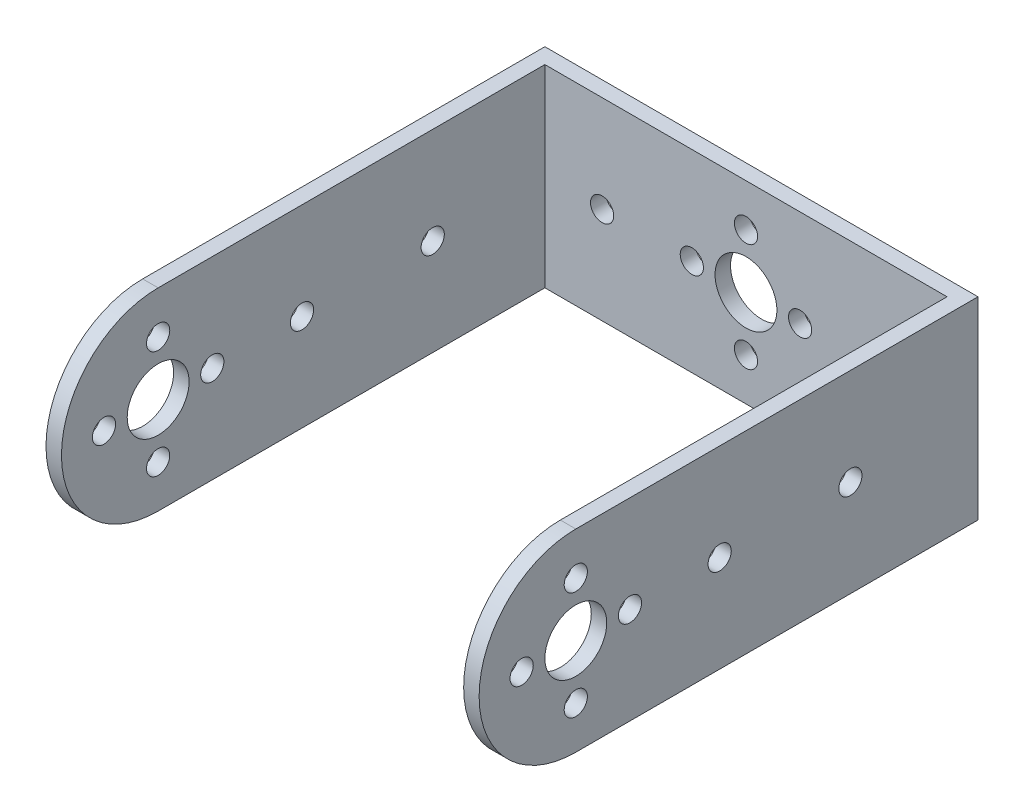
ISO-10303-21;
HEADER;
FILE_DESCRIPTION(('STEP AP214'),'2;1');
FILE_NAME('part.step','',(''),(''),'','','');
FILE_SCHEMA(('AUTOMOTIVE_DESIGN { 1 0 10303 214 1 1 1 1 }'));
ENDSEC;
DATA;
#1=APPLICATION_CONTEXT('core data for automotive mechanical design processes');
#2=APPLICATION_PROTOCOL_DEFINITION('international standard','automotive_design',2000,#1);
#3=PRODUCT_CONTEXT('',#1,'mechanical');
#4=PRODUCT('Part','Part','',(#3));
#5=PRODUCT_RELATED_PRODUCT_CATEGORY('part','',(#4));
#6=PRODUCT_DEFINITION_FORMATION('','',#4);
#7=PRODUCT_DEFINITION_CONTEXT('part definition',#1,'design');
#8=PRODUCT_DEFINITION('design','',#6,#7);
#9=PRODUCT_DEFINITION_SHAPE('','',#8);
#10=(LENGTH_UNIT() NAMED_UNIT(*) SI_UNIT(.MILLI.,.METRE.));
#11=(NAMED_UNIT(*) PLANE_ANGLE_UNIT() SI_UNIT($,.RADIAN.));
#12=(NAMED_UNIT(*) SI_UNIT($,.STERADIAN.) SOLID_ANGLE_UNIT());
#13=UNCERTAINTY_MEASURE_WITH_UNIT(LENGTH_MEASURE(1.E-05),#10,'distance_accuracy_value','');
#14=(GEOMETRIC_REPRESENTATION_CONTEXT(3) GLOBAL_UNCERTAINTY_ASSIGNED_CONTEXT((#13)) GLOBAL_UNIT_ASSIGNED_CONTEXT((#10,
#11,#12)) REPRESENTATION_CONTEXT('',''));
#15=CARTESIAN_POINT('',(0.,0.,0.));
#16=DIRECTION('',(0.,0.,1.));
#17=DIRECTION('',(1.,0.,0.));
#18=AXIS2_PLACEMENT_3D('',#15,#16,#17);
#19=CARTESIAN_POINT('',(28.,12.5,64.5));
#20=DIRECTION('',(-1.,0.,0.));
#21=DIRECTION('',(0.,0.,1.));
#22=AXIS2_PLACEMENT_3D('',#19,#20,#21);
#23=PLANE('',#22);
#24=CARTESIAN_POINT('',(28.,0.,45.));
#25=DIRECTION('',(1.,0.,0.));
#26=DIRECTION('',(0.,0.,-1.));
#27=AXIS2_PLACEMENT_3D('',#24,#25,#26);
#28=CIRCLE('',#27,1.5);
#29=CARTESIAN_POINT('',(28.,0.,43.5));
#30=VERTEX_POINT('',#29);
#31=EDGE_CURVE('E311',#30,#30,#28,.T.);
#32=ORIENTED_EDGE('',*,*,#31,.F.);
#33=EDGE_LOOP('',(#32));
#34=FACE_BOUND('',#33,.T.);
#35=CARTESIAN_POINT('',(28.,-7.00000000000001,52.));
#36=DIRECTION('',(1.,0.,0.));
#37=DIRECTION('',(0.,0.,-1.));
#38=AXIS2_PLACEMENT_3D('',#35,#36,#37);
#39=CIRCLE('',#38,1.5);
#40=CARTESIAN_POINT('',(28.,-7.00000000000001,50.5));
#41=VERTEX_POINT('',#40);
#42=EDGE_CURVE('E315',#41,#41,#39,.T.);
#43=ORIENTED_EDGE('',*,*,#42,.F.);
#44=EDGE_LOOP('',(#43));
#45=FACE_BOUND('',#44,.T.);
#46=CARTESIAN_POINT('',(28.,0.,59.));
#47=DIRECTION('',(1.,0.,0.));
#48=DIRECTION('',(0.,0.,-1.));
#49=AXIS2_PLACEMENT_3D('',#46,#47,#48);
#50=CIRCLE('',#49,1.50000000000002);
#51=CARTESIAN_POINT('',(28.,0.,57.5));
#52=VERTEX_POINT('',#51);
#53=EDGE_CURVE('E319',#52,#52,#50,.T.);
#54=ORIENTED_EDGE('',*,*,#53,.F.);
#55=EDGE_LOOP('',(#54));
#56=FACE_BOUND('',#55,.T.);
#57=CARTESIAN_POINT('',(28.,6.99999999999999,52.));
#58=DIRECTION('',(1.,0.,0.));
#59=DIRECTION('',(0.,0.,-1.));
#60=AXIS2_PLACEMENT_3D('',#57,#58,#59);
#61=CIRCLE('',#60,1.5);
#62=CARTESIAN_POINT('',(28.,6.99999999999999,50.5));
#63=VERTEX_POINT('',#62);
#64=EDGE_CURVE('E323',#63,#63,#61,.T.);
#65=ORIENTED_EDGE('',*,*,#64,.F.);
#66=EDGE_LOOP('',(#65));
#67=FACE_BOUND('',#66,.T.);
#68=CARTESIAN_POINT('',(28.,0.,52.));
#69=DIRECTION('',(1.,0.,0.));
#70=DIRECTION('',(0.,0.,-1.));
#71=AXIS2_PLACEMENT_3D('',#68,#69,#70);
#72=CIRCLE('',#71,4.);
#73=CARTESIAN_POINT('',(28.,0.,48.));
#74=VERTEX_POINT('',#73);
#75=EDGE_CURVE('E327',#74,#74,#72,.T.);
#76=ORIENTED_EDGE('',*,*,#75,.F.);
#77=EDGE_LOOP('',(#76));
#78=FACE_BOUND('',#77,.T.);
#79=CARTESIAN_POINT('',(28.,0.,16.5));
#80=DIRECTION('',(1.,0.,0.));
#81=DIRECTION('',(0.,0.,-1.));
#82=AXIS2_PLACEMENT_3D('',#79,#80,#81);
#83=CIRCLE('',#82,1.5);
#84=CARTESIAN_POINT('',(28.,0.,15.));
#85=VERTEX_POINT('',#84);
#86=EDGE_CURVE('E331',#85,#85,#83,.T.);
#87=ORIENTED_EDGE('',*,*,#86,.F.);
#88=EDGE_LOOP('',(#87));
#89=FACE_BOUND('',#88,.T.);
#90=CARTESIAN_POINT('',(28.,0.,33.4));
#91=DIRECTION('',(1.,0.,0.));
#92=DIRECTION('',(0.,0.,-1.));
#93=AXIS2_PLACEMENT_3D('',#90,#91,#92);
#94=CIRCLE('',#93,1.5);
#95=CARTESIAN_POINT('',(28.,0.,31.9));
#96=VERTEX_POINT('',#95);
#97=EDGE_CURVE('E183',#96,#96,#94,.T.);
#98=ORIENTED_EDGE('',*,*,#97,.F.);
#99=EDGE_LOOP('',(#98));
#100=FACE_BOUND('',#99,.T.);
#101=CARTESIAN_POINT('',(28.,0.,52.));
#102=DIRECTION('',(1.,0.,0.));
#103=DIRECTION('',(0.,0.,-1.));
#104=AXIS2_PLACEMENT_3D('',#101,#102,#103);
#105=CIRCLE('',#104,12.5);
#106=CARTESIAN_POINT('',(28.,12.5,52.));
#107=VERTEX_POINT('',#106);
#108=CARTESIAN_POINT('',(28.,-12.5,52.));
#109=VERTEX_POINT('',#108);
#110=EDGE_CURVE('E117',#107,#109,#105,.T.);
#111=ORIENTED_EDGE('',*,*,#110,.T.);
#112=DIRECTION('',(0.,0.,-1.));
#113=VECTOR('',#112,1.);
#114=CARTESIAN_POINT('',(28.,-12.5,64.5));
#115=LINE('',#114,#113);
#116=CARTESIAN_POINT('',(28.,-12.5,0.));
#117=VERTEX_POINT('',#116);
#118=EDGE_CURVE('E77',#109,#117,#115,.T.);
#119=ORIENTED_EDGE('',*,*,#118,.T.);
#120=DIRECTION('',(0.,1.,0.));
#121=VECTOR('',#120,1.);
#122=CARTESIAN_POINT('',(28.,12.5,0.));
#123=LINE('',#122,#121);
#124=CARTESIAN_POINT('',(28.,12.5,0.));
#125=VERTEX_POINT('',#124);
#126=EDGE_CURVE('E256',#117,#125,#123,.T.);
#127=ORIENTED_EDGE('',*,*,#126,.T.);
#128=DIRECTION('',(0.,0.,-1.));
#129=VECTOR('',#128,1.);
#130=CARTESIAN_POINT('',(28.,12.5,64.5));
#131=LINE('',#130,#129);
#132=EDGE_CURVE('E61',#107,#125,#131,.T.);
#133=ORIENTED_EDGE('',*,*,#132,.F.);
#134=EDGE_LOOP('',(#111,#119,#127,#133));
#135=FACE_BOUND('',#134,.T.);
#136=ADVANCED_FACE('F53',(#34,#45,#56,#67,#78,#89,#100,#135),#23,.F.);
#137=CARTESIAN_POINT('',(-28.,12.5,64.5));
#138=DIRECTION('',(1.,0.,0.));
#139=DIRECTION('',(0.,0.,-1.));
#140=AXIS2_PLACEMENT_3D('',#137,#138,#139);
#141=PLANE('',#140);
#142=CARTESIAN_POINT('',(-28.,0.,45.));
#143=DIRECTION('',(1.,0.,0.));
#144=DIRECTION('',(0.,0.,-1.));
#145=AXIS2_PLACEMENT_3D('',#142,#143,#144);
#146=CIRCLE('',#145,1.5);
#147=CARTESIAN_POINT('',(-28.,0.,43.5));
#148=VERTEX_POINT('',#147);
#149=EDGE_CURVE('E591',#148,#148,#146,.T.);
#150=ORIENTED_EDGE('',*,*,#149,.T.);
#151=EDGE_LOOP('',(#150));
#152=FACE_BOUND('',#151,.T.);
#153=CARTESIAN_POINT('',(-28.,-7.00000000000001,52.));
#154=DIRECTION('',(1.,0.,0.));
#155=DIRECTION('',(0.,0.,-1.));
#156=AXIS2_PLACEMENT_3D('',#153,#154,#155);
#157=CIRCLE('',#156,1.5);
#158=CARTESIAN_POINT('',(-28.,-7.00000000000001,50.5));
#159=VERTEX_POINT('',#158);
#160=EDGE_CURVE('E621',#159,#159,#157,.T.);
#161=ORIENTED_EDGE('',*,*,#160,.T.);
#162=EDGE_LOOP('',(#161));
#163=FACE_BOUND('',#162,.T.);
#164=CARTESIAN_POINT('',(-28.,0.,59.));
#165=DIRECTION('',(1.,0.,0.));
#166=DIRECTION('',(0.,0.,-1.));
#167=AXIS2_PLACEMENT_3D('',#164,#165,#166);
#168=CIRCLE('',#167,1.50000000000002);
#169=CARTESIAN_POINT('',(-28.,0.,57.5));
#170=VERTEX_POINT('',#169);
#171=EDGE_CURVE('E608',#170,#170,#168,.T.);
#172=ORIENTED_EDGE('',*,*,#171,.T.);
#173=EDGE_LOOP('',(#172));
#174=FACE_BOUND('',#173,.T.);
#175=CARTESIAN_POINT('',(-28.,6.99999999999999,52.));
#176=DIRECTION('',(1.,0.,0.));
#177=DIRECTION('',(0.,0.,-1.));
#178=AXIS2_PLACEMENT_3D('',#175,#176,#177);
#179=CIRCLE('',#178,1.5);
#180=CARTESIAN_POINT('',(-28.,6.99999999999999,50.5));
#181=VERTEX_POINT('',#180);
#182=EDGE_CURVE('E604',#181,#181,#179,.T.);
#183=ORIENTED_EDGE('',*,*,#182,.T.);
#184=EDGE_LOOP('',(#183));
#185=FACE_BOUND('',#184,.T.);
#186=CARTESIAN_POINT('',(-28.,0.,52.));
#187=DIRECTION('',(1.,0.,0.));
#188=DIRECTION('',(0.,0.,-1.));
#189=AXIS2_PLACEMENT_3D('',#186,#187,#188);
#190=CIRCLE('',#189,4.);
#191=CARTESIAN_POINT('',(-28.,0.,48.));
#192=VERTEX_POINT('',#191);
#193=EDGE_CURVE('E600',#192,#192,#190,.T.);
#194=ORIENTED_EDGE('',*,*,#193,.T.);
#195=EDGE_LOOP('',(#194));
#196=FACE_BOUND('',#195,.T.);
#197=CARTESIAN_POINT('',(-28.,0.,16.5));
#198=DIRECTION('',(1.,0.,0.));
#199=DIRECTION('',(0.,0.,-1.));
#200=AXIS2_PLACEMENT_3D('',#197,#198,#199);
#201=CIRCLE('',#200,1.5);
#202=CARTESIAN_POINT('',(-28.,0.,15.));
#203=VERTEX_POINT('',#202);
#204=EDGE_CURVE('E154',#203,#203,#201,.T.);
#205=ORIENTED_EDGE('',*,*,#204,.T.);
#206=EDGE_LOOP('',(#205));
#207=FACE_BOUND('',#206,.T.);
#208=CARTESIAN_POINT('',(-28.,0.,33.4));
#209=DIRECTION('',(1.,0.,0.));
#210=DIRECTION('',(0.,0.,-1.));
#211=AXIS2_PLACEMENT_3D('',#208,#209,#210);
#212=CIRCLE('',#211,1.5);
#213=CARTESIAN_POINT('',(-28.,0.,31.9));
#214=VERTEX_POINT('',#213);
#215=EDGE_CURVE('E149',#214,#214,#212,.T.);
#216=ORIENTED_EDGE('',*,*,#215,.T.);
#217=EDGE_LOOP('',(#216));
#218=FACE_BOUND('',#217,.T.);
#219=DIRECTION('',(0.,0.,-1.));
#220=VECTOR('',#219,1.);
#221=CARTESIAN_POINT('',(-28.,-12.5,64.5));
#222=LINE('',#221,#220);
#223=CARTESIAN_POINT('',(-28.,-12.5,52.));
#224=VERTEX_POINT('',#223);
#225=CARTESIAN_POINT('',(-28.,-12.5,0.));
#226=VERTEX_POINT('',#225);
#227=EDGE_CURVE('E136',#224,#226,#222,.T.);
#228=ORIENTED_EDGE('',*,*,#227,.F.);
#229=CARTESIAN_POINT('',(-28.,0.,52.));
#230=DIRECTION('',(1.,0.,0.));
#231=DIRECTION('',(0.,0.,-1.));
#232=AXIS2_PLACEMENT_3D('',#229,#230,#231);
#233=CIRCLE('',#232,12.5);
#234=CARTESIAN_POINT('',(-28.,12.5,52.));
#235=VERTEX_POINT('',#234);
#236=EDGE_CURVE('E119',#235,#224,#233,.T.);
#237=ORIENTED_EDGE('',*,*,#236,.F.);
#238=DIRECTION('',(0.,0.,-1.));
#239=VECTOR('',#238,1.);
#240=CARTESIAN_POINT('',(-28.,12.5,64.5));
#241=LINE('',#240,#239);
#242=CARTESIAN_POINT('',(-28.,12.5,0.));
#243=VERTEX_POINT('',#242);
#244=EDGE_CURVE('E138',#235,#243,#241,.T.);
#245=ORIENTED_EDGE('',*,*,#244,.T.);
#246=DIRECTION('',(0.,-1.,0.));
#247=VECTOR('',#246,1.);
#248=CARTESIAN_POINT('',(-28.,12.5,0.));
#249=LINE('',#248,#247);
#250=EDGE_CURVE('E140',#243,#226,#249,.T.);
#251=ORIENTED_EDGE('',*,*,#250,.T.);
#252=EDGE_LOOP('',(#228,#237,#245,#251));
#253=FACE_BOUND('',#252,.T.);
#254=ADVANCED_FACE('F266',(#152,#163,#174,#185,#196,#207,#218,#253),#141,.F.);
#255=CARTESIAN_POINT('',(26.,12.5,64.5));
#256=DIRECTION('',(1.,0.,0.));
#257=DIRECTION('',(0.,0.,-1.));
#258=AXIS2_PLACEMENT_3D('',#255,#256,#257);
#259=PLANE('',#258);
#260=CARTESIAN_POINT('',(26.,0.,45.));
#261=DIRECTION('',(1.,0.,0.));
#262=DIRECTION('',(0.,0.,-1.));
#263=AXIS2_PLACEMENT_3D('',#260,#261,#262);
#264=CIRCLE('',#263,1.5);
#265=CARTESIAN_POINT('',(26.,0.,43.5));
#266=VERTEX_POINT('',#265);
#267=EDGE_CURVE('E180',#266,#266,#264,.T.);
#268=ORIENTED_EDGE('',*,*,#267,.T.);
#269=EDGE_LOOP('',(#268));
#270=FACE_BOUND('',#269,.T.);
#271=CARTESIAN_POINT('',(26.,-7.00000000000001,52.));
#272=DIRECTION('',(1.,0.,0.));
#273=DIRECTION('',(0.,0.,-1.));
#274=AXIS2_PLACEMENT_3D('',#271,#272,#273);
#275=CIRCLE('',#274,1.5);
#276=CARTESIAN_POINT('',(26.,-7.00000000000001,50.5));
#277=VERTEX_POINT('',#276);
#278=EDGE_CURVE('E168',#277,#277,#275,.T.);
#279=ORIENTED_EDGE('',*,*,#278,.T.);
#280=EDGE_LOOP('',(#279));
#281=FACE_BOUND('',#280,.T.);
#282=CARTESIAN_POINT('',(26.,0.,59.));
#283=DIRECTION('',(1.,0.,0.));
#284=DIRECTION('',(0.,0.,-1.));
#285=AXIS2_PLACEMENT_3D('',#282,#283,#284);
#286=CIRCLE('',#285,1.50000000000002);
#287=CARTESIAN_POINT('',(26.,0.,57.5));
#288=VERTEX_POINT('',#287);
#289=EDGE_CURVE('E165',#288,#288,#286,.T.);
#290=ORIENTED_EDGE('',*,*,#289,.T.);
#291=EDGE_LOOP('',(#290));
#292=FACE_BOUND('',#291,.T.);
#293=CARTESIAN_POINT('',(26.,6.99999999999999,52.));
#294=DIRECTION('',(1.,0.,0.));
#295=DIRECTION('',(0.,0.,-1.));
#296=AXIS2_PLACEMENT_3D('',#293,#294,#295);
#297=CIRCLE('',#296,1.5);
#298=CARTESIAN_POINT('',(26.,6.99999999999999,50.5));
#299=VERTEX_POINT('',#298);
#300=EDGE_CURVE('E162',#299,#299,#297,.T.);
#301=ORIENTED_EDGE('',*,*,#300,.T.);
#302=EDGE_LOOP('',(#301));
#303=FACE_BOUND('',#302,.T.);
#304=CARTESIAN_POINT('',(26.,0.,52.));
#305=DIRECTION('',(1.,0.,0.));
#306=DIRECTION('',(0.,0.,-1.));
#307=AXIS2_PLACEMENT_3D('',#304,#305,#306);
#308=CIRCLE('',#307,4.);
#309=CARTESIAN_POINT('',(26.,0.,48.));
#310=VERTEX_POINT('',#309);
#311=EDGE_CURVE('E158',#310,#310,#308,.T.);
#312=ORIENTED_EDGE('',*,*,#311,.T.);
#313=EDGE_LOOP('',(#312));
#314=FACE_BOUND('',#313,.T.);
#315=CARTESIAN_POINT('',(26.,0.,16.5));
#316=DIRECTION('',(1.,0.,0.));
#317=DIRECTION('',(0.,0.,-1.));
#318=AXIS2_PLACEMENT_3D('',#315,#316,#317);
#319=CIRCLE('',#318,1.5);
#320=CARTESIAN_POINT('',(26.,0.,15.));
#321=VERTEX_POINT('',#320);
#322=EDGE_CURVE('E153',#321,#321,#319,.T.);
#323=ORIENTED_EDGE('',*,*,#322,.T.);
#324=EDGE_LOOP('',(#323));
#325=FACE_BOUND('',#324,.T.);
#326=CARTESIAN_POINT('',(26.,0.,33.4));
#327=DIRECTION('',(1.,0.,0.));
#328=DIRECTION('',(0.,0.,-1.));
#329=AXIS2_PLACEMENT_3D('',#326,#327,#328);
#330=CIRCLE('',#329,1.5);
#331=CARTESIAN_POINT('',(26.,0.,31.9));
#332=VERTEX_POINT('',#331);
#333=EDGE_CURVE('E129',#332,#332,#330,.T.);
#334=ORIENTED_EDGE('',*,*,#333,.T.);
#335=EDGE_LOOP('',(#334));
#336=FACE_BOUND('',#335,.T.);
#337=DIRECTION('',(0.,0.,1.));
#338=VECTOR('',#337,1.);
#339=CARTESIAN_POINT('',(26.,-12.5,64.5));
#340=LINE('',#339,#338);
#341=CARTESIAN_POINT('',(26.,-12.5,1.99999999999999));
#342=VERTEX_POINT('',#341);
#343=CARTESIAN_POINT('',(26.,-12.5,52.));
#344=VERTEX_POINT('',#343);
#345=EDGE_CURVE('E242',#342,#344,#340,.T.);
#346=ORIENTED_EDGE('',*,*,#345,.T.);
#347=CARTESIAN_POINT('',(26.,0.,52.));
#348=DIRECTION('',(1.,0.,0.));
#349=DIRECTION('',(0.,0.,-1.));
#350=AXIS2_PLACEMENT_3D('',#347,#348,#349);
#351=CIRCLE('',#350,12.5);
#352=CARTESIAN_POINT('',(26.,12.5,52.));
#353=VERTEX_POINT('',#352);
#354=EDGE_CURVE('E125',#353,#344,#351,.T.);
#355=ORIENTED_EDGE('',*,*,#354,.F.);
#356=DIRECTION('',(0.,0.,1.));
#357=VECTOR('',#356,1.);
#358=CARTESIAN_POINT('',(26.,12.5,64.5));
#359=LINE('',#358,#357);
#360=CARTESIAN_POINT('',(26.,12.5,1.99999999999999));
#361=VERTEX_POINT('',#360);
#362=EDGE_CURVE('E245',#361,#353,#359,.T.);
#363=ORIENTED_EDGE('',*,*,#362,.F.);
#364=DIRECTION('',(0.,-1.,0.));
#365=VECTOR('',#364,1.);
#366=CARTESIAN_POINT('',(26.,12.5,1.99999999999999));
#367=LINE('',#366,#365);
#368=EDGE_CURVE('E254',#361,#342,#367,.T.);
#369=ORIENTED_EDGE('',*,*,#368,.T.);
#370=EDGE_LOOP('',(#346,#355,#363,#369));
#371=FACE_BOUND('',#370,.T.);
#372=ADVANCED_FACE('F277',(#270,#281,#292,#303,#314,#325,#336,#371),#259,.F.);
#373=CARTESIAN_POINT('',(-26.,12.5,1.99999999999999));
#374=DIRECTION('',(-1.,0.,0.));
#375=DIRECTION('',(0.,0.,1.));
#376=AXIS2_PLACEMENT_3D('',#373,#374,#375);
#377=PLANE('',#376);
#378=CARTESIAN_POINT('',(-26.,0.,45.));
#379=DIRECTION('',(-1.,0.,0.));
#380=DIRECTION('',(0.,0.,1.));
#381=AXIS2_PLACEMENT_3D('',#378,#379,#380);
#382=CIRCLE('',#381,1.5);
#383=CARTESIAN_POINT('',(-26.,0.,46.5));
#384=VERTEX_POINT('',#383);
#385=EDGE_CURVE('E56',#384,#384,#382,.T.);
#386=ORIENTED_EDGE('',*,*,#385,.T.);
#387=EDGE_LOOP('',(#386));
#388=FACE_BOUND('',#387,.T.);
#389=CARTESIAN_POINT('',(-26.,-7.00000000000001,52.));
#390=DIRECTION('',(-1.,0.,0.));
#391=DIRECTION('',(0.,0.,1.));
#392=AXIS2_PLACEMENT_3D('',#389,#390,#391);
#393=CIRCLE('',#392,1.5);
#394=CARTESIAN_POINT('',(-26.,-7.00000000000001,53.5));
#395=VERTEX_POINT('',#394);
#396=EDGE_CURVE('E166',#395,#395,#393,.T.);
#397=ORIENTED_EDGE('',*,*,#396,.T.);
#398=EDGE_LOOP('',(#397));
#399=FACE_BOUND('',#398,.T.);
#400=CARTESIAN_POINT('',(-26.,0.,59.));
#401=DIRECTION('',(-1.,0.,0.));
#402=DIRECTION('',(0.,0.,1.));
#403=AXIS2_PLACEMENT_3D('',#400,#401,#402);
#404=CIRCLE('',#403,1.50000000000002);
#405=CARTESIAN_POINT('',(-26.,0.,60.5));
#406=VERTEX_POINT('',#405);
#407=EDGE_CURVE('E163',#406,#406,#404,.T.);
#408=ORIENTED_EDGE('',*,*,#407,.T.);
#409=EDGE_LOOP('',(#408));
#410=FACE_BOUND('',#409,.T.);
#411=CARTESIAN_POINT('',(-26.,6.99999999999999,52.));
#412=DIRECTION('',(-1.,0.,0.));
#413=DIRECTION('',(0.,0.,1.));
#414=AXIS2_PLACEMENT_3D('',#411,#412,#413);
#415=CIRCLE('',#414,1.5);
#416=CARTESIAN_POINT('',(-26.,6.99999999999999,53.5));
#417=VERTEX_POINT('',#416);
#418=EDGE_CURVE('E159',#417,#417,#415,.T.);
#419=ORIENTED_EDGE('',*,*,#418,.T.);
#420=EDGE_LOOP('',(#419));
#421=FACE_BOUND('',#420,.T.);
#422=CARTESIAN_POINT('',(-26.,0.,52.));
#423=DIRECTION('',(-1.,0.,0.));
#424=DIRECTION('',(0.,0.,1.));
#425=AXIS2_PLACEMENT_3D('',#422,#423,#424);
#426=CIRCLE('',#425,4.);
#427=CARTESIAN_POINT('',(-26.,0.,56.));
#428=VERTEX_POINT('',#427);
#429=EDGE_CURVE('E155',#428,#428,#426,.T.);
#430=ORIENTED_EDGE('',*,*,#429,.T.);
#431=EDGE_LOOP('',(#430));
#432=FACE_BOUND('',#431,.T.);
#433=CARTESIAN_POINT('',(-26.,0.,16.5));
#434=DIRECTION('',(-1.,0.,0.));
#435=DIRECTION('',(0.,0.,1.));
#436=AXIS2_PLACEMENT_3D('',#433,#434,#435);
#437=CIRCLE('',#436,1.5);
#438=CARTESIAN_POINT('',(-26.,0.,18.));
#439=VERTEX_POINT('',#438);
#440=EDGE_CURVE('E150',#439,#439,#437,.T.);
#441=ORIENTED_EDGE('',*,*,#440,.T.);
#442=EDGE_LOOP('',(#441));
#443=FACE_BOUND('',#442,.T.);
#444=CARTESIAN_POINT('',(-26.,0.,33.4));
#445=DIRECTION('',(-1.,0.,0.));
#446=DIRECTION('',(0.,0.,1.));
#447=AXIS2_PLACEMENT_3D('',#444,#445,#446);
#448=CIRCLE('',#447,1.5);
#449=CARTESIAN_POINT('',(-26.,0.,34.9));
#450=VERTEX_POINT('',#449);
#451=EDGE_CURVE('E146',#450,#450,#448,.T.);
#452=ORIENTED_EDGE('',*,*,#451,.T.);
#453=EDGE_LOOP('',(#452));
#454=FACE_BOUND('',#453,.T.);
#455=CARTESIAN_POINT('',(-26.,0.,52.));
#456=DIRECTION('',(-1.,0.,0.));
#457=DIRECTION('',(0.,0.,1.));
#458=AXIS2_PLACEMENT_3D('',#455,#456,#457);
#459=CIRCLE('',#458,12.5);
#460=CARTESIAN_POINT('',(-26.,-12.5,52.));
#461=VERTEX_POINT('',#460);
#462=CARTESIAN_POINT('',(-26.,12.5,52.));
#463=VERTEX_POINT('',#462);
#464=EDGE_CURVE('E12',#461,#463,#459,.T.);
#465=ORIENTED_EDGE('',*,*,#464,.F.);
#466=DIRECTION('',(0.,0.,-1.));
#467=VECTOR('',#466,1.);
#468=CARTESIAN_POINT('',(-26.,-12.5,1.99999999999999));
#469=LINE('',#468,#467);
#470=CARTESIAN_POINT('',(-26.,-12.5,1.99999999999999));
#471=VERTEX_POINT('',#470);
#472=EDGE_CURVE('E236',#461,#471,#469,.T.);
#473=ORIENTED_EDGE('',*,*,#472,.T.);
#474=DIRECTION('',(0.,-1.,0.));
#475=VECTOR('',#474,1.);
#476=CARTESIAN_POINT('',(-26.,12.5,1.99999999999999));
#477=LINE('',#476,#475);
#478=CARTESIAN_POINT('',(-26.,12.5,1.99999999999999));
#479=VERTEX_POINT('',#478);
#480=EDGE_CURVE('E248',#479,#471,#477,.T.);
#481=ORIENTED_EDGE('',*,*,#480,.F.);
#482=DIRECTION('',(0.,0.,-1.));
#483=VECTOR('',#482,1.);
#484=CARTESIAN_POINT('',(-26.,12.5,1.99999999999999));
#485=LINE('',#484,#483);
#486=EDGE_CURVE('E239',#463,#479,#485,.T.);
#487=ORIENTED_EDGE('',*,*,#486,.F.);
#488=EDGE_LOOP('',(#465,#473,#481,#487));
#489=FACE_BOUND('',#488,.T.);
#490=ADVANCED_FACE('F285',(#388,#399,#410,#421,#432,#443,#454,#489),#377,.F.);
#491=CARTESIAN_POINT('',(-28.,-12.5,64.5));
#492=DIRECTION('',(0.,1.,0.));
#493=DIRECTION('',(0.,0.,1.));
#494=AXIS2_PLACEMENT_3D('',#491,#492,#493);
#495=PLANE('',#494);
#496=DIRECTION('',(1.,0.,0.));
#497=VECTOR('',#496,1.);
#498=CARTESIAN_POINT('',(-28.,-12.5,52.));
#499=LINE('',#498,#497);
#500=EDGE_CURVE('E120',#224,#461,#499,.T.);
#501=ORIENTED_EDGE('',*,*,#500,.F.);
#502=ORIENTED_EDGE('',*,*,#227,.T.);
#503=DIRECTION('',(1.,0.,0.));
#504=VECTOR('',#503,1.);
#505=CARTESIAN_POINT('',(-28.,-12.5,0.));
#506=LINE('',#505,#504);
#507=EDGE_CURVE('E134',#226,#117,#506,.T.);
#508=ORIENTED_EDGE('',*,*,#507,.T.);
#509=ORIENTED_EDGE('',*,*,#118,.F.);
#510=EDGE_CURVE('E123',#344,#109,#499,.T.);
#511=ORIENTED_EDGE('',*,*,#510,.F.);
#512=ORIENTED_EDGE('',*,*,#345,.F.);
#513=DIRECTION('',(1.,0.,0.));
#514=VECTOR('',#513,1.);
#515=CARTESIAN_POINT('',(26.,-12.5,1.99999999999999));
#516=LINE('',#515,#514);
#517=EDGE_CURVE('E250',#471,#342,#516,.T.);
#518=ORIENTED_EDGE('',*,*,#517,.F.);
#519=ORIENTED_EDGE('',*,*,#472,.F.);
#520=EDGE_LOOP('',(#501,#502,#508,#509,#511,#512,#518,#519));
#521=FACE_BOUND('',#520,.T.);
#522=ADVANCED_FACE('F132',(#521),#495,.F.);
#523=CARTESIAN_POINT('',(-28.,12.5,64.5));
#524=DIRECTION('',(0.,-1.,0.));
#525=DIRECTION('',(0.,0.,-1.));
#526=AXIS2_PLACEMENT_3D('',#523,#524,#525);
#527=PLANE('',#526);
#528=ORIENTED_EDGE('',*,*,#244,.F.);
#529=DIRECTION('',(1.,0.,0.));
#530=VECTOR('',#529,1.);
#531=CARTESIAN_POINT('',(-28.,12.5,52.));
#532=LINE('',#531,#530);
#533=EDGE_CURVE('E192',#235,#463,#532,.T.);
#534=ORIENTED_EDGE('',*,*,#533,.T.);
#535=ORIENTED_EDGE('',*,*,#486,.T.);
#536=DIRECTION('',(1.,0.,0.));
#537=VECTOR('',#536,1.);
#538=CARTESIAN_POINT('',(26.,12.5,1.99999999999999));
#539=LINE('',#538,#537);
#540=EDGE_CURVE('E241',#479,#361,#539,.T.);
#541=ORIENTED_EDGE('',*,*,#540,.T.);
#542=ORIENTED_EDGE('',*,*,#362,.T.);
#543=EDGE_CURVE('E69',#353,#107,#532,.T.);
#544=ORIENTED_EDGE('',*,*,#543,.T.);
#545=ORIENTED_EDGE('',*,*,#132,.T.);
#546=DIRECTION('',(-1.,0.,0.));
#547=VECTOR('',#546,1.);
#548=CARTESIAN_POINT('',(-28.,12.5,0.));
#549=LINE('',#548,#547);
#550=EDGE_CURVE('E260',#125,#243,#549,.T.);
#551=ORIENTED_EDGE('',*,*,#550,.T.);
#552=EDGE_LOOP('',(#528,#534,#535,#541,#542,#544,#545,#551));
#553=FACE_BOUND('',#552,.T.);
#554=ADVANCED_FACE('F273',(#553),#527,.F.);
#555=CARTESIAN_POINT('',(0.,0.,0.));
#556=DIRECTION('',(0.,0.,1.));
#557=DIRECTION('',(1.,0.,0.));
#558=AXIS2_PLACEMENT_3D('',#555,#556,#557);
#559=PLANE('',#558);
#560=CARTESIAN_POINT('',(7.,0.,0.));
#561=DIRECTION('',(0.,0.,1.));
#562=DIRECTION('',(1.,0.,0.));
#563=AXIS2_PLACEMENT_3D('',#560,#561,#562);
#564=CIRCLE('',#563,1.5);
#565=CARTESIAN_POINT('',(8.5,0.,0.));
#566=VERTEX_POINT('',#565);
#567=EDGE_CURVE('E209',#566,#566,#564,.T.);
#568=ORIENTED_EDGE('',*,*,#567,.T.);
#569=EDGE_LOOP('',(#568));
#570=FACE_BOUND('',#569,.T.);
#571=CARTESIAN_POINT('',(18.6,0.,0.));
#572=DIRECTION('',(0.,0.,1.));
#573=DIRECTION('',(1.,0.,0.));
#574=AXIS2_PLACEMENT_3D('',#571,#572,#573);
#575=CIRCLE('',#574,1.5);
#576=CARTESIAN_POINT('',(20.1,0.,0.));
#577=VERTEX_POINT('',#576);
#578=EDGE_CURVE('E197',#577,#577,#575,.T.);
#579=ORIENTED_EDGE('',*,*,#578,.T.);
#580=EDGE_LOOP('',(#579));
#581=FACE_BOUND('',#580,.T.);
#582=CARTESIAN_POINT('',(-18.6,0.,0.));
#583=DIRECTION('',(0.,0.,1.));
#584=DIRECTION('',(-1.,0.,0.));
#585=AXIS2_PLACEMENT_3D('',#582,#583,#584);
#586=CIRCLE('',#585,1.5);
#587=CARTESIAN_POINT('',(-20.1,0.,0.));
#588=VERTEX_POINT('',#587);
#589=EDGE_CURVE('E204',#588,#588,#586,.T.);
#590=ORIENTED_EDGE('',*,*,#589,.T.);
#591=EDGE_LOOP('',(#590));
#592=FACE_BOUND('',#591,.T.);
#593=CARTESIAN_POINT('',(-7.,0.,0.));
#594=DIRECTION('',(0.,0.,1.));
#595=DIRECTION('',(1.,0.,0.));
#596=AXIS2_PLACEMENT_3D('',#593,#594,#595);
#597=CIRCLE('',#596,1.5);
#598=CARTESIAN_POINT('',(-5.5,0.,0.));
#599=VERTEX_POINT('',#598);
#600=EDGE_CURVE('E228',#599,#599,#597,.T.);
#601=ORIENTED_EDGE('',*,*,#600,.T.);
#602=EDGE_LOOP('',(#601));
#603=FACE_BOUND('',#602,.T.);
#604=CARTESIAN_POINT('',(0.,-7.,0.));
#605=DIRECTION('',(0.,0.,1.));
#606=DIRECTION('',(1.,0.,0.));
#607=AXIS2_PLACEMENT_3D('',#604,#605,#606);
#608=CIRCLE('',#607,1.5);
#609=CARTESIAN_POINT('',(1.5,-7.,0.));
#610=VERTEX_POINT('',#609);
#611=EDGE_CURVE('E222',#610,#610,#608,.T.);
#612=ORIENTED_EDGE('',*,*,#611,.T.);
#613=EDGE_LOOP('',(#612));
#614=FACE_BOUND('',#613,.T.);
#615=CARTESIAN_POINT('',(0.,7.,0.));
#616=DIRECTION('',(0.,0.,1.));
#617=DIRECTION('',(1.,0.,0.));
#618=AXIS2_PLACEMENT_3D('',#615,#616,#617);
#619=CIRCLE('',#618,1.5);
#620=CARTESIAN_POINT('',(1.5,7.,0.));
#621=VERTEX_POINT('',#620);
#622=EDGE_CURVE('E215',#621,#621,#619,.T.);
#623=ORIENTED_EDGE('',*,*,#622,.T.);
#624=EDGE_LOOP('',(#623));
#625=FACE_BOUND('',#624,.T.);
#626=CARTESIAN_POINT('',(0.,0.,0.));
#627=DIRECTION('',(0.,0.,1.));
#628=DIRECTION('',(1.,0.,0.));
#629=AXIS2_PLACEMENT_3D('',#626,#627,#628);
#630=CIRCLE('',#629,4.);
#631=CARTESIAN_POINT('',(4.,0.,0.));
#632=VERTEX_POINT('',#631);
#633=EDGE_CURVE('E233',#632,#632,#630,.T.);
#634=ORIENTED_EDGE('',*,*,#633,.T.);
#635=EDGE_LOOP('',(#634));
#636=FACE_BOUND('',#635,.T.);
#637=ORIENTED_EDGE('',*,*,#126,.F.);
#638=ORIENTED_EDGE('',*,*,#507,.F.);
#639=ORIENTED_EDGE('',*,*,#250,.F.);
#640=ORIENTED_EDGE('',*,*,#550,.F.);
#641=EDGE_LOOP('',(#637,#638,#639,#640));
#642=FACE_BOUND('',#641,.T.);
#643=ADVANCED_FACE('F271',(#570,#581,#592,#603,#614,#625,#636,#642),#559,.F.);
#644=CARTESIAN_POINT('',(26.,12.5,1.99999999999999));
#645=DIRECTION('',(0.,0.,-1.));
#646=DIRECTION('',(-1.,0.,0.));
#647=AXIS2_PLACEMENT_3D('',#644,#645,#646);
#648=PLANE('',#647);
#649=CARTESIAN_POINT('',(7.,0.,1.99999999999999));
#650=DIRECTION('',(0.,0.,1.));
#651=DIRECTION('',(1.,0.,0.));
#652=AXIS2_PLACEMENT_3D('',#649,#650,#651);
#653=CIRCLE('',#652,1.5);
#654=CARTESIAN_POINT('',(8.5,0.,1.99999999999999));
#655=VERTEX_POINT('',#654);
#656=EDGE_CURVE('E200',#655,#655,#653,.T.);
#657=ORIENTED_EDGE('',*,*,#656,.F.);
#658=EDGE_LOOP('',(#657));
#659=FACE_BOUND('',#658,.T.);
#660=CARTESIAN_POINT('',(18.6,0.,1.99999999999999));
#661=DIRECTION('',(0.,0.,1.));
#662=DIRECTION('',(1.,0.,0.));
#663=AXIS2_PLACEMENT_3D('',#660,#661,#662);
#664=CIRCLE('',#663,1.5);
#665=CARTESIAN_POINT('',(20.1,0.,1.99999999999999));
#666=VERTEX_POINT('',#665);
#667=EDGE_CURVE('E201',#666,#666,#664,.T.);
#668=ORIENTED_EDGE('',*,*,#667,.F.);
#669=EDGE_LOOP('',(#668));
#670=FACE_BOUND('',#669,.T.);
#671=CARTESIAN_POINT('',(-18.6,0.,1.99999999999999));
#672=DIRECTION('',(0.,0.,1.));
#673=DIRECTION('',(-1.,0.,0.));
#674=AXIS2_PLACEMENT_3D('',#671,#672,#673);
#675=CIRCLE('',#674,1.5);
#676=CARTESIAN_POINT('',(-20.1,0.,1.99999999999999));
#677=VERTEX_POINT('',#676);
#678=EDGE_CURVE('E196',#677,#677,#675,.T.);
#679=ORIENTED_EDGE('',*,*,#678,.F.);
#680=EDGE_LOOP('',(#679));
#681=FACE_BOUND('',#680,.T.);
#682=CARTESIAN_POINT('',(-7.,0.,1.99999999999999));
#683=DIRECTION('',(0.,0.,1.));
#684=DIRECTION('',(1.,0.,0.));
#685=AXIS2_PLACEMENT_3D('',#682,#683,#684);
#686=CIRCLE('',#685,1.5);
#687=CARTESIAN_POINT('',(-5.5,0.,1.99999999999999));
#688=VERTEX_POINT('',#687);
#689=EDGE_CURVE('E212',#688,#688,#686,.T.);
#690=ORIENTED_EDGE('',*,*,#689,.F.);
#691=EDGE_LOOP('',(#690));
#692=FACE_BOUND('',#691,.T.);
#693=CARTESIAN_POINT('',(0.,-7.,1.99999999999999));
#694=DIRECTION('',(0.,0.,1.));
#695=DIRECTION('',(1.,0.,0.));
#696=AXIS2_PLACEMENT_3D('',#693,#694,#695);
#697=CIRCLE('',#696,1.5);
#698=CARTESIAN_POINT('',(1.5,-7.,1.99999999999999));
#699=VERTEX_POINT('',#698);
#700=EDGE_CURVE('E225',#699,#699,#697,.T.);
#701=ORIENTED_EDGE('',*,*,#700,.F.);
#702=EDGE_LOOP('',(#701));
#703=FACE_BOUND('',#702,.T.);
#704=CARTESIAN_POINT('',(0.,7.,1.99999999999999));
#705=DIRECTION('',(0.,0.,1.));
#706=DIRECTION('',(1.,0.,0.));
#707=AXIS2_PLACEMENT_3D('',#704,#705,#706);
#708=CIRCLE('',#707,1.5);
#709=CARTESIAN_POINT('',(1.5,7.,1.99999999999999));
#710=VERTEX_POINT('',#709);
#711=EDGE_CURVE('E219',#710,#710,#708,.T.);
#712=ORIENTED_EDGE('',*,*,#711,.F.);
#713=EDGE_LOOP('',(#712));
#714=FACE_BOUND('',#713,.T.);
#715=CARTESIAN_POINT('',(0.,0.,1.99999999999999));
#716=DIRECTION('',(0.,0.,1.));
#717=DIRECTION('',(1.,0.,0.));
#718=AXIS2_PLACEMENT_3D('',#715,#716,#717);
#719=CIRCLE('',#718,4.);
#720=CARTESIAN_POINT('',(4.,0.,1.99999999999999));
#721=VERTEX_POINT('',#720);
#722=EDGE_CURVE('E218',#721,#721,#719,.T.);
#723=ORIENTED_EDGE('',*,*,#722,.F.);
#724=EDGE_LOOP('',(#723));
#725=FACE_BOUND('',#724,.T.);
#726=ORIENTED_EDGE('',*,*,#517,.T.);
#727=ORIENTED_EDGE('',*,*,#368,.F.);
#728=ORIENTED_EDGE('',*,*,#540,.F.);
#729=ORIENTED_EDGE('',*,*,#480,.T.);
#730=EDGE_LOOP('',(#726,#727,#728,#729));
#731=FACE_BOUND('',#730,.T.);
#732=ADVANCED_FACE('F281',(#659,#670,#681,#692,#703,#714,#725,#731),#648,.F.);
#733=CARTESIAN_POINT('',(0.,0.,0.));
#734=DIRECTION('',(0.,0.,1.));
#735=DIRECTION('',(1.,0.,0.));
#736=AXIS2_PLACEMENT_3D('',#733,#734,#735);
#737=CYLINDRICAL_SURFACE('',#736,4.);
#738=ORIENTED_EDGE('',*,*,#633,.F.);
#739=EDGE_LOOP('',(#738));
#740=FACE_BOUND('',#739,.T.);
#741=ORIENTED_EDGE('',*,*,#722,.T.);
#742=EDGE_LOOP('',(#741));
#743=FACE_BOUND('',#742,.T.);
#744=ADVANCED_FACE('F351',(#740,#743),#737,.F.);
#745=CARTESIAN_POINT('',(0.,7.,0.));
#746=DIRECTION('',(0.,0.,1.));
#747=DIRECTION('',(1.,0.,0.));
#748=AXIS2_PLACEMENT_3D('',#745,#746,#747);
#749=CYLINDRICAL_SURFACE('',#748,1.5);
#750=ORIENTED_EDGE('',*,*,#622,.F.);
#751=EDGE_LOOP('',(#750));
#752=FACE_BOUND('',#751,.T.);
#753=ORIENTED_EDGE('',*,*,#711,.T.);
#754=EDGE_LOOP('',(#753));
#755=FACE_BOUND('',#754,.T.);
#756=ADVANCED_FACE('F379',(#752,#755),#749,.F.);
#757=CARTESIAN_POINT('',(0.,-7.,0.));
#758=DIRECTION('',(0.,0.,1.));
#759=DIRECTION('',(1.,0.,0.));
#760=AXIS2_PLACEMENT_3D('',#757,#758,#759);
#761=CYLINDRICAL_SURFACE('',#760,1.5);
#762=ORIENTED_EDGE('',*,*,#611,.F.);
#763=EDGE_LOOP('',(#762));
#764=FACE_BOUND('',#763,.T.);
#765=ORIENTED_EDGE('',*,*,#700,.T.);
#766=EDGE_LOOP('',(#765));
#767=FACE_BOUND('',#766,.T.);
#768=ADVANCED_FACE('F386',(#764,#767),#761,.F.);
#769=CARTESIAN_POINT('',(-7.,0.,0.));
#770=DIRECTION('',(0.,0.,1.));
#771=DIRECTION('',(1.,0.,0.));
#772=AXIS2_PLACEMENT_3D('',#769,#770,#771);
#773=CYLINDRICAL_SURFACE('',#772,1.5);
#774=ORIENTED_EDGE('',*,*,#600,.F.);
#775=EDGE_LOOP('',(#774));
#776=FACE_BOUND('',#775,.T.);
#777=ORIENTED_EDGE('',*,*,#689,.T.);
#778=EDGE_LOOP('',(#777));
#779=FACE_BOUND('',#778,.T.);
#780=ADVANCED_FACE('F394',(#776,#779),#773,.F.);
#781=CARTESIAN_POINT('',(-18.6,0.,0.));
#782=DIRECTION('',(0.,0.,1.));
#783=DIRECTION('',(1.,0.,0.));
#784=AXIS2_PLACEMENT_3D('',#781,#782,#783);
#785=CYLINDRICAL_SURFACE('',#784,1.5);
#786=ORIENTED_EDGE('',*,*,#589,.F.);
#787=EDGE_LOOP('',(#786));
#788=FACE_BOUND('',#787,.T.);
#789=ORIENTED_EDGE('',*,*,#678,.T.);
#790=EDGE_LOOP('',(#789));
#791=FACE_BOUND('',#790,.T.);
#792=ADVANCED_FACE('F402',(#788,#791),#785,.F.);
#793=CARTESIAN_POINT('',(18.6,0.,0.));
#794=DIRECTION('',(0.,0.,1.));
#795=DIRECTION('',(1.,0.,0.));
#796=AXIS2_PLACEMENT_3D('',#793,#794,#795);
#797=CYLINDRICAL_SURFACE('',#796,1.5);
#798=ORIENTED_EDGE('',*,*,#578,.F.);
#799=EDGE_LOOP('',(#798));
#800=FACE_BOUND('',#799,.T.);
#801=ORIENTED_EDGE('',*,*,#667,.T.);
#802=EDGE_LOOP('',(#801));
#803=FACE_BOUND('',#802,.T.);
#804=ADVANCED_FACE('F296',(#800,#803),#797,.F.);
#805=CARTESIAN_POINT('',(7.,0.,0.));
#806=DIRECTION('',(0.,0.,1.));
#807=DIRECTION('',(1.,0.,0.));
#808=AXIS2_PLACEMENT_3D('',#805,#806,#807);
#809=CYLINDRICAL_SURFACE('',#808,1.5);
#810=ORIENTED_EDGE('',*,*,#567,.F.);
#811=EDGE_LOOP('',(#810));
#812=FACE_BOUND('',#811,.T.);
#813=ORIENTED_EDGE('',*,*,#656,.T.);
#814=EDGE_LOOP('',(#813));
#815=FACE_BOUND('',#814,.T.);
#816=ADVANCED_FACE('F289',(#812,#815),#809,.F.);
#817=CARTESIAN_POINT('',(-28.,0.,52.));
#818=DIRECTION('',(1.,0.,0.));
#819=DIRECTION('',(0.,0.,-1.));
#820=AXIS2_PLACEMENT_3D('',#817,#818,#819);
#821=CYLINDRICAL_SURFACE('',#820,12.5);
#822=ORIENTED_EDGE('',*,*,#464,.T.);
#823=ORIENTED_EDGE('',*,*,#533,.F.);
#824=ORIENTED_EDGE('',*,*,#236,.T.);
#825=ORIENTED_EDGE('',*,*,#500,.T.);
#826=EDGE_LOOP('',(#822,#823,#824,#825));
#827=FACE_BOUND('',#826,.T.);
#828=ADVANCED_FACE('F287',(#827),#821,.T.);
#829=ORIENTED_EDGE('',*,*,#354,.T.);
#830=ORIENTED_EDGE('',*,*,#510,.T.);
#831=ORIENTED_EDGE('',*,*,#110,.F.);
#832=ORIENTED_EDGE('',*,*,#543,.F.);
#833=EDGE_LOOP('',(#829,#830,#831,#832));
#834=FACE_BOUND('',#833,.T.);
#835=ADVANCED_FACE('F124',(#834),#821,.T.);
#836=CARTESIAN_POINT('',(-28.,0.,33.4));
#837=DIRECTION('',(1.,0.,0.));
#838=DIRECTION('',(0.,0.,-1.));
#839=AXIS2_PLACEMENT_3D('',#836,#837,#838);
#840=CYLINDRICAL_SURFACE('',#839,1.5);
#841=ORIENTED_EDGE('',*,*,#215,.F.);
#842=EDGE_LOOP('',(#841));
#843=FACE_BOUND('',#842,.T.);
#844=ORIENTED_EDGE('',*,*,#451,.F.);
#845=EDGE_LOOP('',(#844));
#846=FACE_BOUND('',#845,.T.);
#847=ADVANCED_FACE('F295',(#843,#846),#840,.F.);
#848=ORIENTED_EDGE('',*,*,#97,.T.);
#849=EDGE_LOOP('',(#848));
#850=FACE_BOUND('',#849,.T.);
#851=ORIENTED_EDGE('',*,*,#333,.F.);
#852=EDGE_LOOP('',(#851));
#853=FACE_BOUND('',#852,.T.);
#854=ADVANCED_FACE('F334',(#850,#853),#840,.F.);
#855=CARTESIAN_POINT('',(-28.,0.,16.5));
#856=DIRECTION('',(1.,0.,0.));
#857=DIRECTION('',(0.,0.,-1.));
#858=AXIS2_PLACEMENT_3D('',#855,#856,#857);
#859=CYLINDRICAL_SURFACE('',#858,1.5);
#860=ORIENTED_EDGE('',*,*,#204,.F.);
#861=EDGE_LOOP('',(#860));
#862=FACE_BOUND('',#861,.T.);
#863=ORIENTED_EDGE('',*,*,#440,.F.);
#864=EDGE_LOOP('',(#863));
#865=FACE_BOUND('',#864,.T.);
#866=ADVANCED_FACE('F337',(#862,#865),#859,.F.);
#867=CARTESIAN_POINT('',(-28.,0.,52.));
#868=DIRECTION('',(1.,0.,0.));
#869=DIRECTION('',(0.,0.,-1.));
#870=AXIS2_PLACEMENT_3D('',#867,#868,#869);
#871=CYLINDRICAL_SURFACE('',#870,4.);
#872=ORIENTED_EDGE('',*,*,#193,.F.);
#873=EDGE_LOOP('',(#872));
#874=FACE_BOUND('',#873,.T.);
#875=ORIENTED_EDGE('',*,*,#429,.F.);
#876=EDGE_LOOP('',(#875));
#877=FACE_BOUND('',#876,.T.);
#878=ADVANCED_FACE('F479',(#874,#877),#871,.F.);
#879=CARTESIAN_POINT('',(-28.,6.99999999999999,52.));
#880=DIRECTION('',(1.,0.,0.));
#881=DIRECTION('',(0.,0.,-1.));
#882=AXIS2_PLACEMENT_3D('',#879,#880,#881);
#883=CYLINDRICAL_SURFACE('',#882,1.5);
#884=ORIENTED_EDGE('',*,*,#182,.F.);
#885=EDGE_LOOP('',(#884));
#886=FACE_BOUND('',#885,.T.);
#887=ORIENTED_EDGE('',*,*,#418,.F.);
#888=EDGE_LOOP('',(#887));
#889=FACE_BOUND('',#888,.T.);
#890=ADVANCED_FACE('F489',(#886,#889),#883,.F.);
#891=CARTESIAN_POINT('',(-28.,0.,59.));
#892=DIRECTION('',(1.,0.,0.));
#893=DIRECTION('',(0.,0.,-1.));
#894=AXIS2_PLACEMENT_3D('',#891,#892,#893);
#895=CYLINDRICAL_SURFACE('',#894,1.50000000000002);
#896=ORIENTED_EDGE('',*,*,#171,.F.);
#897=EDGE_LOOP('',(#896));
#898=FACE_BOUND('',#897,.T.);
#899=ORIENTED_EDGE('',*,*,#407,.F.);
#900=EDGE_LOOP('',(#899));
#901=FACE_BOUND('',#900,.T.);
#902=ADVANCED_FACE('F499',(#898,#901),#895,.F.);
#903=CARTESIAN_POINT('',(-28.,-7.00000000000001,52.));
#904=DIRECTION('',(1.,0.,0.));
#905=DIRECTION('',(0.,0.,-1.));
#906=AXIS2_PLACEMENT_3D('',#903,#904,#905);
#907=CYLINDRICAL_SURFACE('',#906,1.5);
#908=ORIENTED_EDGE('',*,*,#160,.F.);
#909=EDGE_LOOP('',(#908));
#910=FACE_BOUND('',#909,.T.);
#911=ORIENTED_EDGE('',*,*,#396,.F.);
#912=EDGE_LOOP('',(#911));
#913=FACE_BOUND('',#912,.T.);
#914=ADVANCED_FACE('F509',(#910,#913),#907,.F.);
#915=CARTESIAN_POINT('',(-28.,0.,45.));
#916=DIRECTION('',(1.,0.,0.));
#917=DIRECTION('',(0.,0.,-1.));
#918=AXIS2_PLACEMENT_3D('',#915,#916,#917);
#919=CYLINDRICAL_SURFACE('',#918,1.5);
#920=ORIENTED_EDGE('',*,*,#149,.F.);
#921=EDGE_LOOP('',(#920));
#922=FACE_BOUND('',#921,.T.);
#923=ORIENTED_EDGE('',*,*,#385,.F.);
#924=EDGE_LOOP('',(#923));
#925=FACE_BOUND('',#924,.T.);
#926=ADVANCED_FACE('F519',(#922,#925),#919,.F.);
#927=ORIENTED_EDGE('',*,*,#86,.T.);
#928=EDGE_LOOP('',(#927));
#929=FACE_BOUND('',#928,.T.);
#930=ORIENTED_EDGE('',*,*,#322,.F.);
#931=EDGE_LOOP('',(#930));
#932=FACE_BOUND('',#931,.T.);
#933=ADVANCED_FACE('F482',(#929,#932),#859,.F.);
#934=ORIENTED_EDGE('',*,*,#75,.T.);
#935=EDGE_LOOP('',(#934));
#936=FACE_BOUND('',#935,.T.);
#937=ORIENTED_EDGE('',*,*,#311,.F.);
#938=EDGE_LOOP('',(#937));
#939=FACE_BOUND('',#938,.T.);
#940=ADVANCED_FACE('F492',(#936,#939),#871,.F.);
#941=ORIENTED_EDGE('',*,*,#64,.T.);
#942=EDGE_LOOP('',(#941));
#943=FACE_BOUND('',#942,.T.);
#944=ORIENTED_EDGE('',*,*,#300,.F.);
#945=EDGE_LOOP('',(#944));
#946=FACE_BOUND('',#945,.T.);
#947=ADVANCED_FACE('F502',(#943,#946),#883,.F.);
#948=ORIENTED_EDGE('',*,*,#53,.T.);
#949=EDGE_LOOP('',(#948));
#950=FACE_BOUND('',#949,.T.);
#951=ORIENTED_EDGE('',*,*,#289,.F.);
#952=EDGE_LOOP('',(#951));
#953=FACE_BOUND('',#952,.T.);
#954=ADVANCED_FACE('F512',(#950,#953),#895,.F.);
#955=ORIENTED_EDGE('',*,*,#42,.T.);
#956=EDGE_LOOP('',(#955));
#957=FACE_BOUND('',#956,.T.);
#958=ORIENTED_EDGE('',*,*,#278,.F.);
#959=EDGE_LOOP('',(#958));
#960=FACE_BOUND('',#959,.T.);
#961=ADVANCED_FACE('F522',(#957,#960),#907,.F.);
#962=ORIENTED_EDGE('',*,*,#31,.T.);
#963=EDGE_LOOP('',(#962));
#964=FACE_BOUND('',#963,.T.);
#965=ORIENTED_EDGE('',*,*,#267,.F.);
#966=EDGE_LOOP('',(#965));
#967=FACE_BOUND('',#966,.T.);
#968=ADVANCED_FACE('F531',(#964,#967),#919,.F.);
#969=CLOSED_SHELL('',(#136,#254,#372,#490,#522,#554,#643,#732,#744,#756,#768,#780,#792,#804,
#816,#828,#835,#847,#854,#866,#878,#890,#902,#914,#926,#933,#940,#947,#954,#961,#968));
#970=MANIFOLD_SOLID_BREP('B2',#969);
#971=ADVANCED_BREP_SHAPE_REPRESENTATION('',(#18,#970),#14);
#972=SHAPE_DEFINITION_REPRESENTATION(#9,#971);
ENDSEC;
END-ISO-10303-21;
